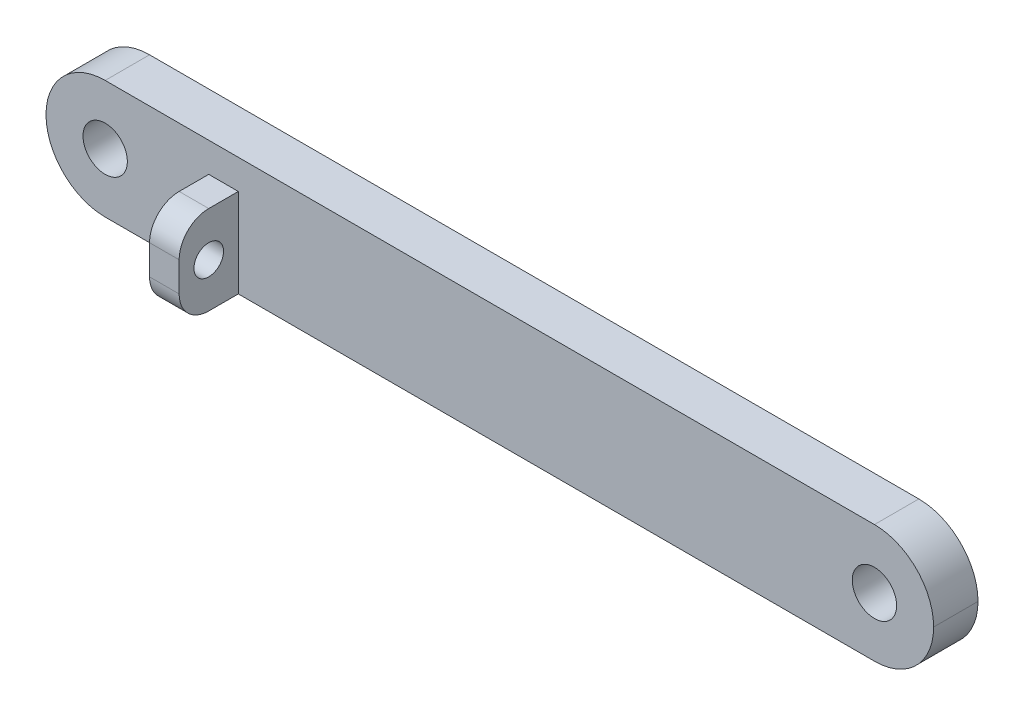
ISO-10303-21;
HEADER;
FILE_DESCRIPTION(('STEP AP214'),'2;1');
FILE_NAME('part.step','',(''),(''),'','','');
FILE_SCHEMA(('AUTOMOTIVE_DESIGN { 1 0 10303 214 1 1 1 1 }'));
ENDSEC;
DATA;
#1=APPLICATION_CONTEXT('core data for automotive mechanical design processes');
#2=APPLICATION_PROTOCOL_DEFINITION('international standard','automotive_design',2000,#1);
#3=PRODUCT_CONTEXT('',#1,'mechanical');
#4=PRODUCT('Part','Part','',(#3));
#5=PRODUCT_RELATED_PRODUCT_CATEGORY('part','',(#4));
#6=PRODUCT_DEFINITION_FORMATION('','',#4);
#7=PRODUCT_DEFINITION_CONTEXT('part definition',#1,'design');
#8=PRODUCT_DEFINITION('design','',#6,#7);
#9=PRODUCT_DEFINITION_SHAPE('','',#8);
#10=(LENGTH_UNIT() NAMED_UNIT(*) SI_UNIT(.MILLI.,.METRE.));
#11=(NAMED_UNIT(*) PLANE_ANGLE_UNIT() SI_UNIT($,.RADIAN.));
#12=(NAMED_UNIT(*) SI_UNIT($,.STERADIAN.) SOLID_ANGLE_UNIT());
#13=UNCERTAINTY_MEASURE_WITH_UNIT(LENGTH_MEASURE(1.E-05),#10,'distance_accuracy_value','');
#14=(GEOMETRIC_REPRESENTATION_CONTEXT(3) GLOBAL_UNCERTAINTY_ASSIGNED_CONTEXT((#13)) GLOBAL_UNIT_ASSIGNED_CONTEXT((#10,
#11,#12)) REPRESENTATION_CONTEXT('',''));
#15=CARTESIAN_POINT('',(0.,0.,0.));
#16=DIRECTION('',(0.,0.,1.));
#17=DIRECTION('',(1.,0.,0.));
#18=AXIS2_PLACEMENT_3D('',#15,#16,#17);
#19=CARTESIAN_POINT('',(0.,0.,3.));
#20=DIRECTION('',(0.,0.,-1.));
#21=DIRECTION('',(-1.,0.,0.));
#22=AXIS2_PLACEMENT_3D('',#19,#20,#21);
#23=PLANE('',#22);
#24=CARTESIAN_POINT('',(56.,4.,3.));
#25=DIRECTION('',(0.,0.,1.));
#26=DIRECTION('',(1.,0.,0.));
#27=AXIS2_PLACEMENT_3D('',#24,#25,#26);
#28=CIRCLE('',#27,1.5);
#29=CARTESIAN_POINT('',(57.5,4.,3.));
#30=VERTEX_POINT('',#29);
#31=EDGE_CURVE('E164',#30,#30,#28,.T.);
#32=ORIENTED_EDGE('',*,*,#31,.F.);
#33=EDGE_LOOP('',(#32));
#34=FACE_BOUND('',#33,.T.);
#35=CARTESIAN_POINT('',(4.,4.,3.));
#36=DIRECTION('',(0.,0.,1.));
#37=DIRECTION('',(1.,0.,0.));
#38=AXIS2_PLACEMENT_3D('',#35,#36,#37);
#39=CIRCLE('',#38,1.5);
#40=CARTESIAN_POINT('',(5.5,4.,3.));
#41=VERTEX_POINT('',#40);
#42=EDGE_CURVE('E170',#41,#41,#39,.T.);
#43=ORIENTED_EDGE('',*,*,#42,.F.);
#44=EDGE_LOOP('',(#43));
#45=FACE_BOUND('',#44,.T.);
#46=DIRECTION('',(0.,-1.,0.));
#47=VECTOR('',#46,1.);
#48=CARTESIAN_POINT('',(11.,0.,3.));
#49=LINE('',#48,#47);
#50=CARTESIAN_POINT('',(11.,6.,3.));
#51=VERTEX_POINT('',#50);
#52=CARTESIAN_POINT('',(11.,0.,3.));
#53=VERTEX_POINT('',#52);
#54=EDGE_CURVE('E144',#51,#53,#49,.T.);
#55=ORIENTED_EDGE('',*,*,#54,.F.);
#56=DIRECTION('',(-1.,0.,0.));
#57=VECTOR('',#56,1.);
#58=CARTESIAN_POINT('',(11.,6.,3.));
#59=LINE('',#58,#57);
#60=CARTESIAN_POINT('',(13.,6.,3.));
#61=VERTEX_POINT('',#60);
#62=EDGE_CURVE('E130',#61,#51,#59,.T.);
#63=ORIENTED_EDGE('',*,*,#62,.F.);
#64=DIRECTION('',(0.,1.,0.));
#65=VECTOR('',#64,1.);
#66=CARTESIAN_POINT('',(13.,0.,3.));
#67=LINE('',#66,#65);
#68=CARTESIAN_POINT('',(13.,0.,3.));
#69=VERTEX_POINT('',#68);
#70=EDGE_CURVE('E140',#69,#61,#67,.T.);
#71=ORIENTED_EDGE('',*,*,#70,.F.);
#72=DIRECTION('',(1.,0.,0.));
#73=VECTOR('',#72,1.);
#74=CARTESIAN_POINT('',(0.,0.,3.));
#75=LINE('',#74,#73);
#76=CARTESIAN_POINT('',(56.,0.,3.));
#77=VERTEX_POINT('',#76);
#78=EDGE_CURVE('E185',#69,#77,#75,.T.);
#79=ORIENTED_EDGE('',*,*,#78,.T.);
#80=CARTESIAN_POINT('',(56.,4.,3.));
#81=DIRECTION('',(0.,0.,-1.));
#82=DIRECTION('',(-1.,0.,0.));
#83=AXIS2_PLACEMENT_3D('',#80,#81,#82);
#84=CIRCLE('',#83,4.);
#85=CARTESIAN_POINT('',(60.,4.,3.));
#86=VERTEX_POINT('',#85);
#87=EDGE_CURVE('E218',#77,#86,#84,.F.);
#88=ORIENTED_EDGE('',*,*,#87,.T.);
#89=CARTESIAN_POINT('',(56.,4.,3.));
#90=DIRECTION('',(0.,0.,-1.));
#91=DIRECTION('',(-1.,0.,0.));
#92=AXIS2_PLACEMENT_3D('',#89,#90,#91);
#93=CIRCLE('',#92,4.);
#94=CARTESIAN_POINT('',(56.,8.,3.));
#95=VERTEX_POINT('',#94);
#96=EDGE_CURVE('E221',#86,#95,#93,.F.);
#97=ORIENTED_EDGE('',*,*,#96,.T.);
#98=DIRECTION('',(-1.,0.,0.));
#99=VECTOR('',#98,1.);
#100=CARTESIAN_POINT('',(0.,8.,3.));
#101=LINE('',#100,#99);
#102=CARTESIAN_POINT('',(4.,8.,3.));
#103=VERTEX_POINT('',#102);
#104=EDGE_CURVE('E184',#95,#103,#101,.T.);
#105=ORIENTED_EDGE('',*,*,#104,.T.);
#106=CARTESIAN_POINT('',(4.,4.,3.));
#107=DIRECTION('',(0.,0.,-1.));
#108=DIRECTION('',(-1.,0.,0.));
#109=AXIS2_PLACEMENT_3D('',#106,#107,#108);
#110=CIRCLE('',#109,4.);
#111=CARTESIAN_POINT('',(0.,4.,3.));
#112=VERTEX_POINT('',#111);
#113=EDGE_CURVE('E224',#103,#112,#110,.F.);
#114=ORIENTED_EDGE('',*,*,#113,.T.);
#115=CARTESIAN_POINT('',(4.,4.,3.));
#116=DIRECTION('',(0.,0.,-1.));
#117=DIRECTION('',(-1.,0.,0.));
#118=AXIS2_PLACEMENT_3D('',#115,#116,#117);
#119=CIRCLE('',#118,4.);
#120=CARTESIAN_POINT('',(4.,0.,3.));
#121=VERTEX_POINT('',#120);
#122=EDGE_CURVE('E227',#112,#121,#119,.F.);
#123=ORIENTED_EDGE('',*,*,#122,.T.);
#124=EDGE_CURVE('E181',#121,#53,#75,.T.);
#125=ORIENTED_EDGE('',*,*,#124,.T.);
#126=EDGE_LOOP('',(#55,#63,#71,#79,#88,#97,#105,#114,#123,#125));
#127=FACE_BOUND('',#126,.T.);
#128=ADVANCED_FACE('F39',(#34,#45,#127),#23,.F.);
#129=CARTESIAN_POINT('',(0.,0.,3.));
#130=DIRECTION('',(0.,1.,0.));
#131=DIRECTION('',(0.,0.,1.));
#132=AXIS2_PLACEMENT_3D('',#129,#130,#131);
#133=PLANE('',#132);
#134=DIRECTION('',(0.,0.,-1.));
#135=VECTOR('',#134,1.);
#136=CARTESIAN_POINT('',(13.,0.,7.));
#137=LINE('',#136,#135);
#138=CARTESIAN_POINT('',(13.,0.,5.));
#139=VERTEX_POINT('',#138);
#140=EDGE_CURVE('E134',#139,#69,#137,.T.);
#141=ORIENTED_EDGE('',*,*,#140,.F.);
#142=DIRECTION('',(1.,0.,0.));
#143=VECTOR('',#142,1.);
#144=CARTESIAN_POINT('',(0.,0.,5.));
#145=LINE('',#144,#143);
#146=CARTESIAN_POINT('',(11.,0.,5.));
#147=VERTEX_POINT('',#146);
#148=EDGE_CURVE('E11',#139,#147,#145,.F.);
#149=ORIENTED_EDGE('',*,*,#148,.T.);
#150=DIRECTION('',(0.,0.,-1.));
#151=VECTOR('',#150,1.);
#152=CARTESIAN_POINT('',(11.,0.,7.));
#153=LINE('',#152,#151);
#154=EDGE_CURVE('E161',#147,#53,#153,.T.);
#155=ORIENTED_EDGE('',*,*,#154,.T.);
#156=ORIENTED_EDGE('',*,*,#124,.F.);
#157=DIRECTION('',(0.,0.,-1.));
#158=VECTOR('',#157,1.);
#159=CARTESIAN_POINT('',(4.,0.,3.));
#160=LINE('',#159,#158);
#161=CARTESIAN_POINT('',(4.,0.,0.));
#162=VERTEX_POINT('',#161);
#163=EDGE_CURVE('E202',#121,#162,#160,.T.);
#164=ORIENTED_EDGE('',*,*,#163,.T.);
#165=DIRECTION('',(1.,0.,0.));
#166=VECTOR('',#165,1.);
#167=CARTESIAN_POINT('',(0.,0.,0.));
#168=LINE('',#167,#166);
#169=CARTESIAN_POINT('',(56.,0.,0.));
#170=VERTEX_POINT('',#169);
#171=EDGE_CURVE('E190',#162,#170,#168,.T.);
#172=ORIENTED_EDGE('',*,*,#171,.T.);
#173=DIRECTION('',(0.,0.,-1.));
#174=VECTOR('',#173,1.);
#175=CARTESIAN_POINT('',(56.,0.,3.));
#176=LINE('',#175,#174);
#177=EDGE_CURVE('E189',#170,#77,#176,.F.);
#178=ORIENTED_EDGE('',*,*,#177,.T.);
#179=ORIENTED_EDGE('',*,*,#78,.F.);
#180=EDGE_LOOP('',(#141,#149,#155,#156,#164,#172,#178,#179));
#181=FACE_BOUND('',#180,.T.);
#182=ADVANCED_FACE('F302',(#181),#133,.F.);
#183=CARTESIAN_POINT('',(0.,8.,3.));
#184=DIRECTION('',(0.,-1.,0.));
#185=DIRECTION('',(0.,0.,-1.));
#186=AXIS2_PLACEMENT_3D('',#183,#184,#185);
#187=PLANE('',#186);
#188=DIRECTION('',(-1.,0.,0.));
#189=VECTOR('',#188,1.);
#190=CARTESIAN_POINT('',(0.,8.,0.));
#191=LINE('',#190,#189);
#192=CARTESIAN_POINT('',(56.,8.,0.));
#193=VERTEX_POINT('',#192);
#194=CARTESIAN_POINT('',(4.,8.,0.));
#195=VERTEX_POINT('',#194);
#196=EDGE_CURVE('E194',#193,#195,#191,.T.);
#197=ORIENTED_EDGE('',*,*,#196,.T.);
#198=DIRECTION('',(0.,0.,-1.));
#199=VECTOR('',#198,1.);
#200=CARTESIAN_POINT('',(4.,8.,3.));
#201=LINE('',#200,#199);
#202=EDGE_CURVE('E234',#195,#103,#201,.F.);
#203=ORIENTED_EDGE('',*,*,#202,.T.);
#204=ORIENTED_EDGE('',*,*,#104,.F.);
#205=DIRECTION('',(0.,0.,-1.));
#206=VECTOR('',#205,1.);
#207=CARTESIAN_POINT('',(56.,8.,3.));
#208=LINE('',#207,#206);
#209=EDGE_CURVE('E230',#95,#193,#208,.T.);
#210=ORIENTED_EDGE('',*,*,#209,.T.);
#211=EDGE_LOOP('',(#197,#203,#204,#210));
#212=FACE_BOUND('',#211,.T.);
#213=ADVANCED_FACE('F308',(#212),#187,.F.);
#214=CARTESIAN_POINT('',(0.,0.,0.));
#215=DIRECTION('',(0.,0.,-1.));
#216=DIRECTION('',(-1.,0.,0.));
#217=AXIS2_PLACEMENT_3D('',#214,#215,#216);
#218=PLANE('',#217);
#219=CARTESIAN_POINT('',(4.,4.,0.));
#220=DIRECTION('',(0.,0.,1.));
#221=DIRECTION('',(1.,0.,0.));
#222=AXIS2_PLACEMENT_3D('',#219,#220,#221);
#223=CIRCLE('',#222,1.5);
#224=CARTESIAN_POINT('',(5.5,4.,0.));
#225=VERTEX_POINT('',#224);
#226=EDGE_CURVE('E165',#225,#225,#223,.T.);
#227=ORIENTED_EDGE('',*,*,#226,.T.);
#228=EDGE_LOOP('',(#227));
#229=FACE_BOUND('',#228,.T.);
#230=CARTESIAN_POINT('',(56.,4.,0.));
#231=DIRECTION('',(0.,0.,1.));
#232=DIRECTION('',(1.,0.,0.));
#233=AXIS2_PLACEMENT_3D('',#230,#231,#232);
#234=CIRCLE('',#233,1.5);
#235=CARTESIAN_POINT('',(57.5,4.,0.));
#236=VERTEX_POINT('',#235);
#237=EDGE_CURVE('E174',#236,#236,#234,.T.);
#238=ORIENTED_EDGE('',*,*,#237,.T.);
#239=EDGE_LOOP('',(#238));
#240=FACE_BOUND('',#239,.T.);
#241=ORIENTED_EDGE('',*,*,#171,.F.);
#242=CARTESIAN_POINT('',(4.,4.,0.));
#243=DIRECTION('',(0.,0.,-1.));
#244=DIRECTION('',(-1.,0.,0.));
#245=AXIS2_PLACEMENT_3D('',#242,#243,#244);
#246=CIRCLE('',#245,4.);
#247=CARTESIAN_POINT('',(0.,4.,0.));
#248=VERTEX_POINT('',#247);
#249=EDGE_CURVE('E215',#162,#248,#246,.T.);
#250=ORIENTED_EDGE('',*,*,#249,.T.);
#251=CARTESIAN_POINT('',(4.,4.,0.));
#252=DIRECTION('',(0.,0.,-1.));
#253=DIRECTION('',(-1.,0.,0.));
#254=AXIS2_PLACEMENT_3D('',#251,#252,#253);
#255=CIRCLE('',#254,4.);
#256=EDGE_CURVE('E212',#248,#195,#255,.T.);
#257=ORIENTED_EDGE('',*,*,#256,.T.);
#258=ORIENTED_EDGE('',*,*,#196,.F.);
#259=CARTESIAN_POINT('',(56.,4.,0.));
#260=DIRECTION('',(0.,0.,-1.));
#261=DIRECTION('',(-1.,0.,0.));
#262=AXIS2_PLACEMENT_3D('',#259,#260,#261);
#263=CIRCLE('',#262,4.);
#264=CARTESIAN_POINT('',(60.,4.,0.));
#265=VERTEX_POINT('',#264);
#266=EDGE_CURVE('E209',#193,#265,#263,.T.);
#267=ORIENTED_EDGE('',*,*,#266,.T.);
#268=CARTESIAN_POINT('',(56.,4.,0.));
#269=DIRECTION('',(0.,0.,-1.));
#270=DIRECTION('',(-1.,0.,0.));
#271=AXIS2_PLACEMENT_3D('',#268,#269,#270);
#272=CIRCLE('',#271,4.);
#273=EDGE_CURVE('E206',#265,#170,#272,.T.);
#274=ORIENTED_EDGE('',*,*,#273,.T.);
#275=EDGE_LOOP('',(#241,#250,#257,#258,#267,#274));
#276=FACE_BOUND('',#275,.T.);
#277=ADVANCED_FACE('F315',(#229,#240,#276),#218,.T.);
#278=CARTESIAN_POINT('',(4.,4.,3.));
#279=DIRECTION('',(0.,0.,-1.));
#280=DIRECTION('',(-1.,0.,0.));
#281=AXIS2_PLACEMENT_3D('',#278,#279,#280);
#282=CYLINDRICAL_SURFACE('',#281,4.);
#283=DIRECTION('',(0.,0.,-1.));
#284=VECTOR('',#283,1.);
#285=CARTESIAN_POINT('',(0.,4.,3.));
#286=LINE('',#285,#284);
#287=EDGE_CURVE('E195',#112,#248,#286,.T.);
#288=ORIENTED_EDGE('',*,*,#287,.F.);
#289=ORIENTED_EDGE('',*,*,#113,.F.);
#290=ORIENTED_EDGE('',*,*,#202,.F.);
#291=ORIENTED_EDGE('',*,*,#256,.F.);
#292=EDGE_LOOP('',(#288,#289,#290,#291));
#293=FACE_BOUND('',#292,.T.);
#294=ADVANCED_FACE('F318',(#293),#282,.T.);
#295=CARTESIAN_POINT('',(4.,4.,3.));
#296=DIRECTION('',(0.,0.,-1.));
#297=DIRECTION('',(-1.,0.,0.));
#298=AXIS2_PLACEMENT_3D('',#295,#296,#297);
#299=CYLINDRICAL_SURFACE('',#298,4.);
#300=ORIENTED_EDGE('',*,*,#122,.F.);
#301=ORIENTED_EDGE('',*,*,#287,.T.);
#302=ORIENTED_EDGE('',*,*,#249,.F.);
#303=ORIENTED_EDGE('',*,*,#163,.F.);
#304=EDGE_LOOP('',(#300,#301,#302,#303));
#305=FACE_BOUND('',#304,.T.);
#306=ADVANCED_FACE('F323',(#305),#299,.T.);
#307=CARTESIAN_POINT('',(56.,4.,3.));
#308=DIRECTION('',(0.,0.,-1.));
#309=DIRECTION('',(-1.,0.,0.));
#310=AXIS2_PLACEMENT_3D('',#307,#308,#309);
#311=CYLINDRICAL_SURFACE('',#310,4.);
#312=DIRECTION('',(0.,0.,-1.));
#313=VECTOR('',#312,1.);
#314=CARTESIAN_POINT('',(60.,4.,3.));
#315=LINE('',#314,#313);
#316=EDGE_CURVE('E169',#86,#265,#315,.T.);
#317=ORIENTED_EDGE('',*,*,#316,.F.);
#318=ORIENTED_EDGE('',*,*,#87,.F.);
#319=ORIENTED_EDGE('',*,*,#177,.F.);
#320=ORIENTED_EDGE('',*,*,#273,.F.);
#321=EDGE_LOOP('',(#317,#318,#319,#320));
#322=FACE_BOUND('',#321,.T.);
#323=ADVANCED_FACE('F326',(#322),#311,.T.);
#324=CARTESIAN_POINT('',(56.,4.,3.));
#325=DIRECTION('',(0.,0.,-1.));
#326=DIRECTION('',(-1.,0.,0.));
#327=AXIS2_PLACEMENT_3D('',#324,#325,#326);
#328=CYLINDRICAL_SURFACE('',#327,4.);
#329=ORIENTED_EDGE('',*,*,#96,.F.);
#330=ORIENTED_EDGE('',*,*,#316,.T.);
#331=ORIENTED_EDGE('',*,*,#266,.F.);
#332=ORIENTED_EDGE('',*,*,#209,.F.);
#333=EDGE_LOOP('',(#329,#330,#331,#332));
#334=FACE_BOUND('',#333,.T.);
#335=ADVANCED_FACE('F331',(#334),#328,.T.);
#336=CARTESIAN_POINT('',(56.,4.,0.));
#337=DIRECTION('',(0.,0.,1.));
#338=DIRECTION('',(1.,0.,0.));
#339=AXIS2_PLACEMENT_3D('',#336,#337,#338);
#340=CYLINDRICAL_SURFACE('',#339,1.5);
#341=ORIENTED_EDGE('',*,*,#237,.F.);
#342=EDGE_LOOP('',(#341));
#343=FACE_BOUND('',#342,.T.);
#344=ORIENTED_EDGE('',*,*,#31,.T.);
#345=EDGE_LOOP('',(#344));
#346=FACE_BOUND('',#345,.T.);
#347=ADVANCED_FACE('F298',(#343,#346),#340,.F.);
#348=CARTESIAN_POINT('',(4.,4.,0.));
#349=DIRECTION('',(0.,0.,1.));
#350=DIRECTION('',(1.,0.,0.));
#351=AXIS2_PLACEMENT_3D('',#348,#349,#350);
#352=CYLINDRICAL_SURFACE('',#351,1.5);
#353=ORIENTED_EDGE('',*,*,#226,.F.);
#354=EDGE_LOOP('',(#353));
#355=FACE_BOUND('',#354,.T.);
#356=ORIENTED_EDGE('',*,*,#42,.T.);
#357=EDGE_LOOP('',(#356));
#358=FACE_BOUND('',#357,.T.);
#359=ADVANCED_FACE('F290',(#355,#358),#352,.F.);
#360=CARTESIAN_POINT('',(11.,0.,7.));
#361=DIRECTION('',(1.,0.,0.));
#362=DIRECTION('',(0.,0.,-1.));
#363=AXIS2_PLACEMENT_3D('',#360,#361,#362);
#364=PLANE('',#363);
#365=CARTESIAN_POINT('',(11.,3.,5.));
#366=DIRECTION('',(-1.,0.,0.));
#367=DIRECTION('',(0.,0.,1.));
#368=AXIS2_PLACEMENT_3D('',#365,#366,#367);
#369=CIRCLE('',#368,1.);
#370=CARTESIAN_POINT('',(11.,3.,6.));
#371=VERTEX_POINT('',#370);
#372=EDGE_CURVE('E281',#371,#371,#369,.T.);
#373=ORIENTED_EDGE('',*,*,#372,.F.);
#374=EDGE_LOOP('',(#373));
#375=FACE_BOUND('',#374,.T.);
#376=DIRECTION('',(0.,-1.,0.));
#377=VECTOR('',#376,1.);
#378=CARTESIAN_POINT('',(11.,0.,7.));
#379=LINE('',#378,#377);
#380=CARTESIAN_POINT('',(11.,4.,7.));
#381=VERTEX_POINT('',#380);
#382=CARTESIAN_POINT('',(11.,2.,7.));
#383=VERTEX_POINT('',#382);
#384=EDGE_CURVE('E146',#381,#383,#379,.T.);
#385=ORIENTED_EDGE('',*,*,#384,.F.);
#386=CARTESIAN_POINT('',(11.,4.,5.));
#387=DIRECTION('',(1.,0.,0.));
#388=DIRECTION('',(0.,0.,-1.));
#389=AXIS2_PLACEMENT_3D('',#386,#387,#388);
#390=CIRCLE('',#389,2.);
#391=CARTESIAN_POINT('',(11.,6.,5.));
#392=VERTEX_POINT('',#391);
#393=EDGE_CURVE('E254',#381,#392,#390,.F.);
#394=ORIENTED_EDGE('',*,*,#393,.T.);
#395=DIRECTION('',(0.,0.,-1.));
#396=VECTOR('',#395,1.);
#397=CARTESIAN_POINT('',(11.,6.,7.));
#398=LINE('',#397,#396);
#399=EDGE_CURVE('E135',#392,#51,#398,.T.);
#400=ORIENTED_EDGE('',*,*,#399,.T.);
#401=ORIENTED_EDGE('',*,*,#54,.T.);
#402=ORIENTED_EDGE('',*,*,#154,.F.);
#403=CARTESIAN_POINT('',(11.,2.,5.));
#404=DIRECTION('',(1.,0.,0.));
#405=DIRECTION('',(0.,0.,-1.));
#406=AXIS2_PLACEMENT_3D('',#403,#404,#405);
#407=CIRCLE('',#406,2.);
#408=EDGE_CURVE('E251',#147,#383,#407,.F.);
#409=ORIENTED_EDGE('',*,*,#408,.T.);
#410=EDGE_LOOP('',(#385,#394,#400,#401,#402,#409));
#411=FACE_BOUND('',#410,.T.);
#412=ADVANCED_FACE('F272',(#375,#411),#364,.F.);
#413=CARTESIAN_POINT('',(13.,0.,7.));
#414=DIRECTION('',(-1.,0.,0.));
#415=DIRECTION('',(0.,0.,1.));
#416=AXIS2_PLACEMENT_3D('',#413,#414,#415);
#417=PLANE('',#416);
#418=CARTESIAN_POINT('',(13.,3.,5.));
#419=DIRECTION('',(-1.,0.,0.));
#420=DIRECTION('',(0.,0.,1.));
#421=AXIS2_PLACEMENT_3D('',#418,#419,#420);
#422=CIRCLE('',#421,1.);
#423=CARTESIAN_POINT('',(13.,3.,6.));
#424=VERTEX_POINT('',#423);
#425=EDGE_CURVE('E152',#424,#424,#422,.F.);
#426=ORIENTED_EDGE('',*,*,#425,.F.);
#427=EDGE_LOOP('',(#426));
#428=FACE_BOUND('',#427,.T.);
#429=DIRECTION('',(0.,0.,-1.));
#430=VECTOR('',#429,1.);
#431=CARTESIAN_POINT('',(13.,6.,7.));
#432=LINE('',#431,#430);
#433=CARTESIAN_POINT('',(13.,6.,5.));
#434=VERTEX_POINT('',#433);
#435=EDGE_CURVE('E127',#434,#61,#432,.T.);
#436=ORIENTED_EDGE('',*,*,#435,.F.);
#437=CARTESIAN_POINT('',(13.,4.,5.));
#438=DIRECTION('',(-1.,0.,0.));
#439=DIRECTION('',(0.,0.,1.));
#440=AXIS2_PLACEMENT_3D('',#437,#438,#439);
#441=CIRCLE('',#440,2.);
#442=CARTESIAN_POINT('',(13.,4.,7.));
#443=VERTEX_POINT('',#442);
#444=EDGE_CURVE('E48',#434,#443,#441,.F.);
#445=ORIENTED_EDGE('',*,*,#444,.T.);
#446=DIRECTION('',(0.,1.,0.));
#447=VECTOR('',#446,1.);
#448=CARTESIAN_POINT('',(13.,0.,7.));
#449=LINE('',#448,#447);
#450=CARTESIAN_POINT('',(13.,2.,7.));
#451=VERTEX_POINT('',#450);
#452=EDGE_CURVE('E157',#451,#443,#449,.T.);
#453=ORIENTED_EDGE('',*,*,#452,.F.);
#454=CARTESIAN_POINT('',(13.,2.,5.));
#455=DIRECTION('',(-1.,0.,0.));
#456=DIRECTION('',(0.,0.,1.));
#457=AXIS2_PLACEMENT_3D('',#454,#455,#456);
#458=CIRCLE('',#457,2.);
#459=EDGE_CURVE('E55',#451,#139,#458,.F.);
#460=ORIENTED_EDGE('',*,*,#459,.T.);
#461=ORIENTED_EDGE('',*,*,#140,.T.);
#462=ORIENTED_EDGE('',*,*,#70,.T.);
#463=EDGE_LOOP('',(#436,#445,#453,#460,#461,#462));
#464=FACE_BOUND('',#463,.T.);
#465=ADVANCED_FACE('F148',(#428,#464),#417,.F.);
#466=CARTESIAN_POINT('',(11.,6.,7.));
#467=DIRECTION('',(0.,-1.,0.));
#468=DIRECTION('',(0.,0.,-1.));
#469=AXIS2_PLACEMENT_3D('',#466,#467,#468);
#470=PLANE('',#469);
#471=ORIENTED_EDGE('',*,*,#399,.F.);
#472=DIRECTION('',(-1.,0.,0.));
#473=VECTOR('',#472,1.);
#474=CARTESIAN_POINT('',(11.,6.,5.));
#475=LINE('',#474,#473);
#476=EDGE_CURVE('E63',#392,#434,#475,.F.);
#477=ORIENTED_EDGE('',*,*,#476,.T.);
#478=ORIENTED_EDGE('',*,*,#435,.T.);
#479=ORIENTED_EDGE('',*,*,#62,.T.);
#480=EDGE_LOOP('',(#471,#477,#478,#479));
#481=FACE_BOUND('',#480,.T.);
#482=ADVANCED_FACE('F129',(#481),#470,.F.);
#483=CARTESIAN_POINT('',(0.,0.,7.));
#484=DIRECTION('',(0.,0.,-1.));
#485=DIRECTION('',(-1.,0.,0.));
#486=AXIS2_PLACEMENT_3D('',#483,#484,#485);
#487=PLANE('',#486);
#488=ORIENTED_EDGE('',*,*,#452,.T.);
#489=DIRECTION('',(-1.,0.,0.));
#490=VECTOR('',#489,1.);
#491=CARTESIAN_POINT('',(0.,4.,7.));
#492=LINE('',#491,#490);
#493=EDGE_CURVE('E247',#443,#381,#492,.T.);
#494=ORIENTED_EDGE('',*,*,#493,.T.);
#495=ORIENTED_EDGE('',*,*,#384,.T.);
#496=DIRECTION('',(1.,0.,0.));
#497=VECTOR('',#496,1.);
#498=CARTESIAN_POINT('',(0.,2.,7.));
#499=LINE('',#498,#497);
#500=EDGE_CURVE('E237',#383,#451,#499,.T.);
#501=ORIENTED_EDGE('',*,*,#500,.T.);
#502=EDGE_LOOP('',(#488,#494,#495,#501));
#503=FACE_BOUND('',#502,.T.);
#504=ADVANCED_FACE('F265',(#503),#487,.F.);
#505=CARTESIAN_POINT('',(60.001,3.,5.));
#506=DIRECTION('',(-1.,0.,0.));
#507=DIRECTION('',(0.,0.,1.));
#508=AXIS2_PLACEMENT_3D('',#505,#506,#507);
#509=CYLINDRICAL_SURFACE('',#508,1.);
#510=ORIENTED_EDGE('',*,*,#372,.T.);
#511=EDGE_LOOP('',(#510));
#512=FACE_BOUND('',#511,.T.);
#513=ORIENTED_EDGE('',*,*,#425,.T.);
#514=EDGE_LOOP('',(#513));
#515=FACE_BOUND('',#514,.T.);
#516=ADVANCED_FACE('F286',(#512,#515),#509,.F.);
#517=CARTESIAN_POINT('',(0.,4.,5.));
#518=DIRECTION('',(-1.,0.,0.));
#519=DIRECTION('',(0.,0.,1.));
#520=AXIS2_PLACEMENT_3D('',#517,#518,#519);
#521=CYLINDRICAL_SURFACE('',#520,2.);
#522=ORIENTED_EDGE('',*,*,#444,.F.);
#523=ORIENTED_EDGE('',*,*,#476,.F.);
#524=ORIENTED_EDGE('',*,*,#393,.F.);
#525=ORIENTED_EDGE('',*,*,#493,.F.);
#526=EDGE_LOOP('',(#522,#523,#524,#525));
#527=FACE_BOUND('',#526,.T.);
#528=ADVANCED_FACE('F270',(#527),#521,.T.);
#529=CARTESIAN_POINT('',(0.,2.,5.));
#530=DIRECTION('',(1.,0.,0.));
#531=DIRECTION('',(0.,0.,-1.));
#532=AXIS2_PLACEMENT_3D('',#529,#530,#531);
#533=CYLINDRICAL_SURFACE('',#532,2.);
#534=ORIENTED_EDGE('',*,*,#408,.F.);
#535=ORIENTED_EDGE('',*,*,#148,.F.);
#536=ORIENTED_EDGE('',*,*,#459,.F.);
#537=ORIENTED_EDGE('',*,*,#500,.F.);
#538=EDGE_LOOP('',(#534,#535,#536,#537));
#539=FACE_BOUND('',#538,.T.);
#540=ADVANCED_FACE('F41',(#539),#533,.T.);
#541=CLOSED_SHELL('',(#128,#182,#213,#277,#294,#306,#323,#335,#347,#359,#412,#465,#482,#504,
#516,#528,#540));
#542=MANIFOLD_SOLID_BREP('B2',#541);
#543=ADVANCED_BREP_SHAPE_REPRESENTATION('',(#18,#542),#14);
#544=SHAPE_DEFINITION_REPRESENTATION(#9,#543);
ENDSEC;
END-ISO-10303-21;
